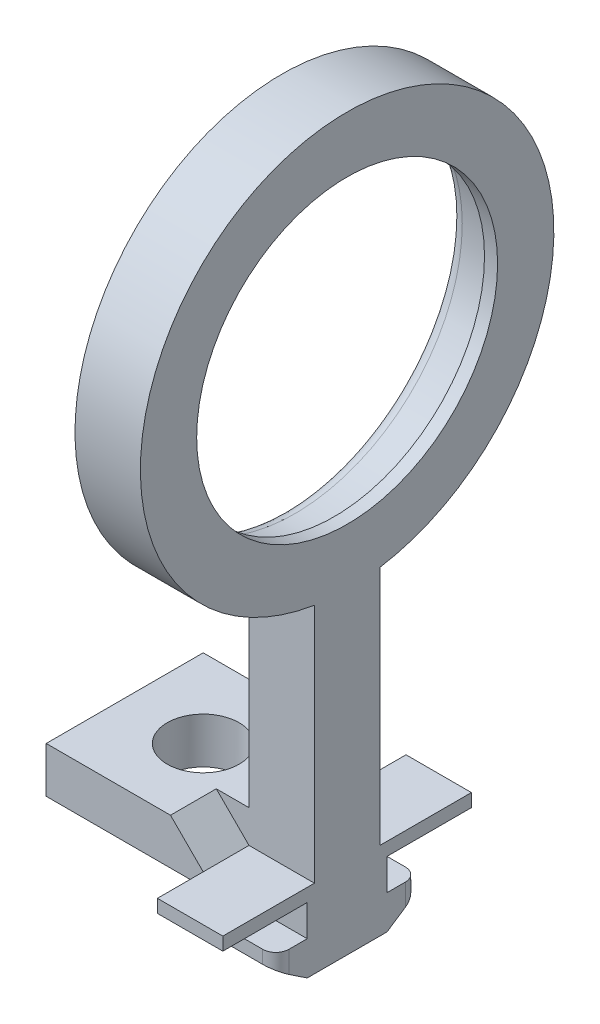
ISO-10303-21;
HEADER;
FILE_DESCRIPTION(('STEP AP214'),'2;1');
FILE_NAME('part.step','',(''),(''),'','','');
FILE_SCHEMA(('AUTOMOTIVE_DESIGN { 1 0 10303 214 1 1 1 1 }'));
ENDSEC;
DATA;
#1=APPLICATION_CONTEXT('core data for automotive mechanical design processes');
#2=APPLICATION_PROTOCOL_DEFINITION('international standard','automotive_design',2000,#1);
#3=PRODUCT_CONTEXT('',#1,'mechanical');
#4=PRODUCT('Part','Part','',(#3));
#5=PRODUCT_RELATED_PRODUCT_CATEGORY('part','',(#4));
#6=PRODUCT_DEFINITION_FORMATION('','',#4);
#7=PRODUCT_DEFINITION_CONTEXT('part definition',#1,'design');
#8=PRODUCT_DEFINITION('design','',#6,#7);
#9=PRODUCT_DEFINITION_SHAPE('','',#8);
#10=(LENGTH_UNIT() NAMED_UNIT(*) SI_UNIT(.MILLI.,.METRE.));
#11=(NAMED_UNIT(*) PLANE_ANGLE_UNIT() SI_UNIT($,.RADIAN.));
#12=(NAMED_UNIT(*) SI_UNIT($,.STERADIAN.) SOLID_ANGLE_UNIT());
#13=UNCERTAINTY_MEASURE_WITH_UNIT(LENGTH_MEASURE(1.E-05),#10,'distance_accuracy_value','');
#14=(GEOMETRIC_REPRESENTATION_CONTEXT(3) GLOBAL_UNCERTAINTY_ASSIGNED_CONTEXT((#13)) GLOBAL_UNIT_ASSIGNED_CONTEXT((#10,
#11,#12)) REPRESENTATION_CONTEXT('',''));
#15=CARTESIAN_POINT('',(0.,0.,0.));
#16=DIRECTION('',(0.,0.,1.));
#17=DIRECTION('',(1.,0.,0.));
#18=AXIS2_PLACEMENT_3D('',#15,#16,#17);
#19=CARTESIAN_POINT('',(-5.,0.,0.));
#20=DIRECTION('',(1.,0.,0.));
#21=DIRECTION('',(0.,0.,-1.));
#22=AXIS2_PLACEMENT_3D('',#19,#20,#21);
#23=CYLINDRICAL_SURFACE('',#22,12.8);
#24=CARTESIAN_POINT('',(-4.,0.,0.));
#25=DIRECTION('',(1.,0.,0.));
#26=DIRECTION('',(0.,0.,-1.));
#27=AXIS2_PLACEMENT_3D('',#24,#25,#26);
#28=CIRCLE('',#27,12.8);
#29=CARTESIAN_POINT('',(-4.,0.,-12.8));
#30=VERTEX_POINT('',#29);
#31=EDGE_CURVE('E52',#30,#30,#28,.F.);
#32=ORIENTED_EDGE('',*,*,#31,.T.);
#33=EDGE_LOOP('',(#32));
#34=FACE_BOUND('',#33,.T.);
#35=CARTESIAN_POINT('',(-1.,0.,0.));
#36=DIRECTION('',(1.,0.,0.));
#37=DIRECTION('',(0.,0.,-1.));
#38=AXIS2_PLACEMENT_3D('',#35,#36,#37);
#39=CIRCLE('',#38,12.8);
#40=CARTESIAN_POINT('',(-1.,0.,-12.8));
#41=VERTEX_POINT('',#40);
#42=EDGE_CURVE('E11',#41,#41,#39,.F.);
#43=ORIENTED_EDGE('',*,*,#42,.F.);
#44=EDGE_LOOP('',(#43));
#45=FACE_BOUND('',#44,.T.);
#46=ADVANCED_FACE('F43',(#34,#45),#23,.F.);
#47=CARTESIAN_POINT('',(-5.,0.,0.));
#48=DIRECTION('',(1.,0.,0.));
#49=DIRECTION('',(0.,0.,-1.));
#50=AXIS2_PLACEMENT_3D('',#47,#48,#49);
#51=PLANE('',#50);
#52=DIRECTION('',(0.,1.,0.));
#53=VECTOR('',#52,1.);
#54=CARTESIAN_POINT('',(-5.,-31.5,5.99999999999999));
#55=LINE('',#54,#53);
#56=CARTESIAN_POINT('',(-5.,-35.,5.99999999999999));
#57=VERTEX_POINT('',#56);
#58=CARTESIAN_POINT('',(-5.,-34.,5.99999999999999));
#59=VERTEX_POINT('',#58);
#60=EDGE_CURVE('E247',#57,#59,#55,.T.);
#61=ORIENTED_EDGE('',*,*,#60,.F.);
#62=DIRECTION('',(0.,0.,-1.));
#63=VECTOR('',#62,1.);
#64=CARTESIAN_POINT('',(-5.,-35.,3.05));
#65=LINE('',#64,#63);
#66=CARTESIAN_POINT('',(-5.,-35.,9.5));
#67=VERTEX_POINT('',#66);
#68=EDGE_CURVE('E275',#67,#57,#65,.T.);
#69=ORIENTED_EDGE('',*,*,#68,.F.);
#70=DIRECTION('',(0.,-1.,0.));
#71=VECTOR('',#70,1.);
#72=CARTESIAN_POINT('',(-5.,-35.,9.5));
#73=LINE('',#72,#71);
#74=CARTESIAN_POINT('',(-5.,-34.,9.50000000000001));
#75=VERTEX_POINT('',#74);
#76=EDGE_CURVE('E268',#75,#67,#73,.T.);
#77=ORIENTED_EDGE('',*,*,#76,.F.);
#78=DIRECTION('',(0.,0.,1.));
#79=VECTOR('',#78,1.);
#80=CARTESIAN_POINT('',(-5.,-34.,9.50000000000001));
#81=LINE('',#80,#79);
#82=EDGE_CURVE('E270',#59,#75,#81,.T.);
#83=ORIENTED_EDGE('',*,*,#82,.F.);
#84=EDGE_LOOP('',(#61,#69,#77,#83));
#85=FACE_BOUND('',#84,.T.);
#86=ADVANCED_FACE('F522',(#85),#51,.F.);
#87=DIRECTION('',(0.,0.,1.));
#88=VECTOR('',#87,1.);
#89=CARTESIAN_POINT('',(-5.,-35.,-6.00000000000001));
#90=LINE('',#89,#88);
#91=CARTESIAN_POINT('',(-5.,-35.,-3.05));
#92=VERTEX_POINT('',#91);
#93=CARTESIAN_POINT('',(-5.,-35.,3.05));
#94=VERTEX_POINT('',#93);
#95=EDGE_CURVE('E482',#92,#94,#90,.T.);
#96=ORIENTED_EDGE('',*,*,#95,.F.);
#97=DIRECTION('',(0.,1.,0.));
#98=VECTOR('',#97,1.);
#99=CARTESIAN_POINT('',(-5.,-35.,-3.05));
#100=LINE('',#99,#98);
#101=CARTESIAN_POINT('',(-5.,-37.4,-3.05));
#102=VERTEX_POINT('',#101);
#103=EDGE_CURVE('E311',#102,#92,#100,.T.);
#104=ORIENTED_EDGE('',*,*,#103,.F.);
#105=DIRECTION('',(0.,0.,1.));
#106=VECTOR('',#105,1.);
#107=CARTESIAN_POINT('',(-5.,-37.4,-3.05));
#108=LINE('',#107,#106);
#109=CARTESIAN_POINT('',(-5.,-37.4,-5.45));
#110=VERTEX_POINT('',#109);
#111=EDGE_CURVE('E307',#110,#102,#108,.T.);
#112=ORIENTED_EDGE('',*,*,#111,.F.);
#113=DIRECTION('',(0.,1.,0.));
#114=VECTOR('',#113,1.);
#115=CARTESIAN_POINT('',(-5.,-37.4,-5.45));
#116=LINE('',#115,#114);
#117=CARTESIAN_POINT('',(-5.,-38.4,-5.45));
#118=VERTEX_POINT('',#117);
#119=EDGE_CURVE('E303',#118,#110,#116,.T.);
#120=ORIENTED_EDGE('',*,*,#119,.F.);
#121=DIRECTION('',(0.,0.55470019622523,-0.832050294337843));
#122=VECTOR('',#121,1.);
#123=CARTESIAN_POINT('',(-5.,-38.4,-5.45));
#124=LINE('',#123,#122);
#125=CARTESIAN_POINT('',(-5.,-40.,-3.05));
#126=VERTEX_POINT('',#125);
#127=EDGE_CURVE('E299',#126,#118,#124,.T.);
#128=ORIENTED_EDGE('',*,*,#127,.F.);
#129=DIRECTION('',(0.,0.,-1.));
#130=VECTOR('',#129,1.);
#131=CARTESIAN_POINT('',(-5.,-40.,-3.05));
#132=LINE('',#131,#130);
#133=CARTESIAN_POINT('',(-5.,-40.,3.05));
#134=VERTEX_POINT('',#133);
#135=EDGE_CURVE('E295',#134,#126,#132,.T.);
#136=ORIENTED_EDGE('',*,*,#135,.F.);
#137=DIRECTION('',(0.,-0.554700196225229,-0.832050294337844));
#138=VECTOR('',#137,1.);
#139=CARTESIAN_POINT('',(-5.,-38.4,5.45));
#140=LINE('',#139,#138);
#141=CARTESIAN_POINT('',(-5.,-38.4,5.45));
#142=VERTEX_POINT('',#141);
#143=EDGE_CURVE('E291',#142,#134,#140,.T.);
#144=ORIENTED_EDGE('',*,*,#143,.F.);
#145=DIRECTION('',(0.,-1.,0.));
#146=VECTOR('',#145,1.);
#147=CARTESIAN_POINT('',(-5.,-37.4,5.45));
#148=LINE('',#147,#146);
#149=CARTESIAN_POINT('',(-5.,-37.4,5.45));
#150=VERTEX_POINT('',#149);
#151=EDGE_CURVE('E287',#150,#142,#148,.T.);
#152=ORIENTED_EDGE('',*,*,#151,.F.);
#153=DIRECTION('',(0.,0.,1.));
#154=VECTOR('',#153,1.);
#155=CARTESIAN_POINT('',(-5.,-37.4,3.05));
#156=LINE('',#155,#154);
#157=CARTESIAN_POINT('',(-5.,-37.4,3.05));
#158=VERTEX_POINT('',#157);
#159=EDGE_CURVE('E283',#158,#150,#156,.T.);
#160=ORIENTED_EDGE('',*,*,#159,.F.);
#161=DIRECTION('',(0.,-1.,0.));
#162=VECTOR('',#161,1.);
#163=CARTESIAN_POINT('',(-5.,-35.,3.05));
#164=LINE('',#163,#162);
#165=EDGE_CURVE('E279',#94,#158,#164,.T.);
#166=ORIENTED_EDGE('',*,*,#165,.F.);
#167=EDGE_LOOP('',(#96,#104,#112,#120,#128,#136,#144,#152,#160,#166));
#168=FACE_BOUND('',#167,.T.);
#169=ADVANCED_FACE('F558',(#168),#51,.F.);
#170=DIRECTION('',(0.,-1.,0.));
#171=VECTOR('',#170,1.);
#172=CARTESIAN_POINT('',(-5.,-31.5,-6.00000000000001));
#173=LINE('',#172,#171);
#174=CARTESIAN_POINT('',(-5.,-34.,-6.00000000000001));
#175=VERTEX_POINT('',#174);
#176=CARTESIAN_POINT('',(-5.,-35.,-6.00000000000001));
#177=VERTEX_POINT('',#176);
#178=EDGE_CURVE('E528',#175,#177,#173,.T.);
#179=ORIENTED_EDGE('',*,*,#178,.F.);
#180=CARTESIAN_POINT('',(-5.,-34.,-9.5));
#181=VERTEX_POINT('',#180);
#182=EDGE_CURVE('E264',#181,#175,#81,.T.);
#183=ORIENTED_EDGE('',*,*,#182,.F.);
#184=DIRECTION('',(0.,1.,0.));
#185=VECTOR('',#184,1.);
#186=CARTESIAN_POINT('',(-5.,-34.,-9.5));
#187=LINE('',#186,#185);
#188=CARTESIAN_POINT('',(-5.,-35.,-9.5));
#189=VERTEX_POINT('',#188);
#190=EDGE_CURVE('E318',#189,#181,#187,.T.);
#191=ORIENTED_EDGE('',*,*,#190,.F.);
#192=DIRECTION('',(0.,0.,-1.));
#193=VECTOR('',#192,1.);
#194=CARTESIAN_POINT('',(-5.,-35.,-3.05));
#195=LINE('',#194,#193);
#196=EDGE_CURVE('E315',#177,#189,#195,.T.);
#197=ORIENTED_EDGE('',*,*,#196,.F.);
#198=EDGE_LOOP('',(#179,#183,#191,#197));
#199=FACE_BOUND('',#198,.T.);
#200=ADVANCED_FACE('F520',(#199),#51,.F.);
#201=CARTESIAN_POINT('',(-5.,0.,0.));
#202=DIRECTION('',(1.,0.,0.));
#203=DIRECTION('',(0.,0.,-1.));
#204=AXIS2_PLACEMENT_3D('',#201,#202,#203);
#205=CIRCLE('',#204,13.8);
#206=CARTESIAN_POINT('',(-5.,0.,-13.8));
#207=VERTEX_POINT('',#206);
#208=EDGE_CURVE('E501',#207,#207,#205,.T.);
#209=ORIENTED_EDGE('',*,*,#208,.T.);
#210=EDGE_LOOP('',(#209));
#211=FACE_BOUND('',#210,.T.);
#212=DIRECTION('',(0.,0.,-1.));
#213=VECTOR('',#212,1.);
#214=CARTESIAN_POINT('',(-5.,-31.5,-6.00000000000001));
#215=LINE('',#214,#213);
#216=CARTESIAN_POINT('',(-5.,-31.5,2.5));
#217=VERTEX_POINT('',#216);
#218=CARTESIAN_POINT('',(-5.,-31.5,-2.5));
#219=VERTEX_POINT('',#218);
#220=EDGE_CURVE('E478',#217,#219,#215,.T.);
#221=ORIENTED_EDGE('',*,*,#220,.F.);
#222=DIRECTION('',(0.,-1.,0.));
#223=VECTOR('',#222,1.);
#224=CARTESIAN_POINT('',(-5.,-35.,2.5));
#225=LINE('',#224,#223);
#226=CARTESIAN_POINT('',(-5.,-15.6009615088301,2.5));
#227=VERTEX_POINT('',#226);
#228=EDGE_CURVE('E422',#227,#217,#225,.T.);
#229=ORIENTED_EDGE('',*,*,#228,.F.);
#230=CARTESIAN_POINT('',(-5.,0.,0.));
#231=DIRECTION('',(1.,0.,0.));
#232=DIRECTION('',(0.,0.,-1.));
#233=AXIS2_PLACEMENT_3D('',#230,#231,#232);
#234=CIRCLE('',#233,15.8);
#235=CARTESIAN_POINT('',(-5.,-15.6009615088301,-2.5));
#236=VERTEX_POINT('',#235);
#237=EDGE_CURVE('E441',#236,#227,#234,.T.);
#238=ORIENTED_EDGE('',*,*,#237,.F.);
#239=DIRECTION('',(0.,1.,0.));
#240=VECTOR('',#239,1.);
#241=CARTESIAN_POINT('',(-5.,-35.,-2.5));
#242=LINE('',#241,#240);
#243=EDGE_CURVE('E419',#219,#236,#242,.T.);
#244=ORIENTED_EDGE('',*,*,#243,.F.);
#245=EDGE_LOOP('',(#221,#229,#238,#244));
#246=FACE_BOUND('',#245,.T.);
#247=ADVANCED_FACE('F516',(#211,#246),#51,.F.);
#248=CARTESIAN_POINT('',(-5.,0.,0.));
#249=DIRECTION('',(1.,0.,0.));
#250=DIRECTION('',(0.,0.,-1.));
#251=AXIS2_PLACEMENT_3D('',#248,#249,#250);
#252=CYLINDRICAL_SURFACE('',#251,15.8);
#253=DIRECTION('',(1.,0.,0.));
#254=VECTOR('',#253,1.);
#255=CARTESIAN_POINT('',(-5.,-15.6009615088301,2.5));
#256=LINE('',#255,#254);
#257=CARTESIAN_POINT('',(0.,-15.6009615088301,2.5));
#258=VERTEX_POINT('',#257);
#259=EDGE_CURVE('E433',#227,#258,#256,.T.);
#260=ORIENTED_EDGE('',*,*,#259,.T.);
#261=CARTESIAN_POINT('',(0.,0.,0.));
#262=DIRECTION('',(1.,0.,0.));
#263=DIRECTION('',(0.,0.,-1.));
#264=AXIS2_PLACEMENT_3D('',#261,#262,#263);
#265=CIRCLE('',#264,15.8);
#266=CARTESIAN_POINT('',(0.,-15.6009615088301,-2.5));
#267=VERTEX_POINT('',#266);
#268=EDGE_CURVE('E437',#267,#258,#265,.T.);
#269=ORIENTED_EDGE('',*,*,#268,.F.);
#270=DIRECTION('',(1.,0.,0.));
#271=VECTOR('',#270,1.);
#272=CARTESIAN_POINT('',(-5.,-15.6009615088301,-2.5));
#273=LINE('',#272,#271);
#274=EDGE_CURVE('E427',#236,#267,#273,.T.);
#275=ORIENTED_EDGE('',*,*,#274,.F.);
#276=ORIENTED_EDGE('',*,*,#237,.T.);
#277=EDGE_LOOP('',(#260,#269,#275,#276));
#278=FACE_BOUND('',#277,.T.);
#279=ADVANCED_FACE('F519',(#278),#252,.T.);
#280=CARTESIAN_POINT('',(0.,0.,0.));
#281=DIRECTION('',(1.,0.,0.));
#282=DIRECTION('',(0.,0.,-1.));
#283=AXIS2_PLACEMENT_3D('',#280,#281,#282);
#284=PLANE('',#283);
#285=DIRECTION('',(0.,0.,1.));
#286=VECTOR('',#285,1.);
#287=CARTESIAN_POINT('',(0.,-37.4,3.05));
#288=LINE('',#287,#286);
#289=CARTESIAN_POINT('',(0.,-37.4,3.05));
#290=VERTEX_POINT('',#289);
#291=CARTESIAN_POINT('',(0.,-37.4,4.45));
#292=VERTEX_POINT('',#291);
#293=EDGE_CURVE('E337',#290,#292,#288,.T.);
#294=ORIENTED_EDGE('',*,*,#293,.T.);
#295=DIRECTION('',(0.,-1.,0.));
#296=VECTOR('',#295,1.);
#297=CARTESIAN_POINT('',(0.,0.,4.45000000000013));
#298=LINE('',#297,#296);
#299=CARTESIAN_POINT('',(0.,-39.0666666666667,4.44999999999999));
#300=VERTEX_POINT('',#299);
#301=EDGE_CURVE('E456',#292,#300,#298,.T.);
#302=ORIENTED_EDGE('',*,*,#301,.T.);
#303=DIRECTION('',(0.,-0.554700196225229,-0.832050294337844));
#304=VECTOR('',#303,1.);
#305=CARTESIAN_POINT('',(0.,-38.4,5.45));
#306=LINE('',#305,#304);
#307=CARTESIAN_POINT('',(0.,-40.,3.05));
#308=VERTEX_POINT('',#307);
#309=EDGE_CURVE('E341',#300,#308,#306,.T.);
#310=ORIENTED_EDGE('',*,*,#309,.T.);
#311=DIRECTION('',(0.,0.,-1.));
#312=VECTOR('',#311,1.);
#313=CARTESIAN_POINT('',(0.,-40.,-3.05));
#314=LINE('',#313,#312);
#315=CARTESIAN_POINT('',(0.,-40.,-3.05));
#316=VERTEX_POINT('',#315);
#317=EDGE_CURVE('E344',#308,#316,#314,.T.);
#318=ORIENTED_EDGE('',*,*,#317,.T.);
#319=DIRECTION('',(0.,0.55470019622523,-0.832050294337843));
#320=VECTOR('',#319,1.);
#321=CARTESIAN_POINT('',(0.,-38.4,-5.45));
#322=LINE('',#321,#320);
#323=CARTESIAN_POINT('',(0.,-39.0666666666667,-4.45));
#324=VERTEX_POINT('',#323);
#325=EDGE_CURVE('E348',#316,#324,#322,.T.);
#326=ORIENTED_EDGE('',*,*,#325,.T.);
#327=DIRECTION('',(0.,1.,0.));
#328=VECTOR('',#327,1.);
#329=CARTESIAN_POINT('',(0.,0.,-4.45000000000003));
#330=LINE('',#329,#328);
#331=CARTESIAN_POINT('',(0.,-37.4,-4.45));
#332=VERTEX_POINT('',#331);
#333=EDGE_CURVE('E452',#324,#332,#330,.T.);
#334=ORIENTED_EDGE('',*,*,#333,.T.);
#335=DIRECTION('',(0.,0.,1.));
#336=VECTOR('',#335,1.);
#337=CARTESIAN_POINT('',(0.,-37.4,-3.05));
#338=LINE('',#337,#336);
#339=CARTESIAN_POINT('',(0.,-37.4,-3.05));
#340=VERTEX_POINT('',#339);
#341=EDGE_CURVE('E352',#332,#340,#338,.T.);
#342=ORIENTED_EDGE('',*,*,#341,.T.);
#343=DIRECTION('',(0.,1.,0.));
#344=VECTOR('',#343,1.);
#345=CARTESIAN_POINT('',(0.,-35.,-3.05));
#346=LINE('',#345,#344);
#347=CARTESIAN_POINT('',(0.,-35.,-3.05));
#348=VERTEX_POINT('',#347);
#349=EDGE_CURVE('E355',#340,#348,#346,.T.);
#350=ORIENTED_EDGE('',*,*,#349,.T.);
#351=DIRECTION('',(0.,0.,-1.));
#352=VECTOR('',#351,1.);
#353=CARTESIAN_POINT('',(0.,-35.,-3.05));
#354=LINE('',#353,#352);
#355=CARTESIAN_POINT('',(0.,-35.,-9.5));
#356=VERTEX_POINT('',#355);
#357=EDGE_CURVE('E359',#348,#356,#354,.T.);
#358=ORIENTED_EDGE('',*,*,#357,.T.);
#359=DIRECTION('',(0.,1.,0.));
#360=VECTOR('',#359,1.);
#361=CARTESIAN_POINT('',(0.,-34.,-9.5));
#362=LINE('',#361,#360);
#363=CARTESIAN_POINT('',(0.,-34.,-9.5));
#364=VERTEX_POINT('',#363);
#365=EDGE_CURVE('E363',#356,#364,#362,.T.);
#366=ORIENTED_EDGE('',*,*,#365,.T.);
#367=DIRECTION('',(0.,0.,1.));
#368=VECTOR('',#367,1.);
#369=CARTESIAN_POINT('',(0.,-34.,9.50000000000001));
#370=LINE('',#369,#368);
#371=CARTESIAN_POINT('',(0.,-34.,-2.5));
#372=VERTEX_POINT('',#371);
#373=EDGE_CURVE('E258',#364,#372,#370,.T.);
#374=ORIENTED_EDGE('',*,*,#373,.T.);
#375=DIRECTION('',(0.,1.,0.));
#376=VECTOR('',#375,1.);
#377=CARTESIAN_POINT('',(0.,-35.,-2.5));
#378=LINE('',#377,#376);
#379=EDGE_CURVE('E418',#372,#267,#378,.T.);
#380=ORIENTED_EDGE('',*,*,#379,.T.);
#381=ORIENTED_EDGE('',*,*,#268,.T.);
#382=DIRECTION('',(0.,-1.,0.));
#383=VECTOR('',#382,1.);
#384=CARTESIAN_POINT('',(0.,-35.,2.5));
#385=LINE('',#384,#383);
#386=CARTESIAN_POINT('',(0.,-34.,2.5));
#387=VERTEX_POINT('',#386);
#388=EDGE_CURVE('E423',#258,#387,#385,.T.);
#389=ORIENTED_EDGE('',*,*,#388,.T.);
#390=CARTESIAN_POINT('',(0.,-34.,9.50000000000001));
#391=VERTEX_POINT('',#390);
#392=EDGE_CURVE('E254',#387,#391,#370,.T.);
#393=ORIENTED_EDGE('',*,*,#392,.T.);
#394=DIRECTION('',(0.,-1.,0.));
#395=VECTOR('',#394,1.);
#396=CARTESIAN_POINT('',(0.,-35.,9.5));
#397=LINE('',#396,#395);
#398=CARTESIAN_POINT('',(0.,-35.,9.5));
#399=VERTEX_POINT('',#398);
#400=EDGE_CURVE('E325',#391,#399,#397,.T.);
#401=ORIENTED_EDGE('',*,*,#400,.T.);
#402=DIRECTION('',(0.,0.,-1.));
#403=VECTOR('',#402,1.);
#404=CARTESIAN_POINT('',(0.,-35.,3.05));
#405=LINE('',#404,#403);
#406=CARTESIAN_POINT('',(0.,-35.,3.05));
#407=VERTEX_POINT('',#406);
#408=EDGE_CURVE('E329',#399,#407,#405,.T.);
#409=ORIENTED_EDGE('',*,*,#408,.T.);
#410=DIRECTION('',(0.,-1.,0.));
#411=VECTOR('',#410,1.);
#412=CARTESIAN_POINT('',(0.,-35.,3.05));
#413=LINE('',#412,#411);
#414=EDGE_CURVE('E333',#407,#290,#413,.T.);
#415=ORIENTED_EDGE('',*,*,#414,.T.);
#416=EDGE_LOOP('',(#294,#302,#310,#318,#326,#334,#342,#350,#358,#366,#374,#380,#381,#389,#393,
#401,#409,#415));
#417=FACE_BOUND('',#416,.T.);
#418=CARTESIAN_POINT('',(0.,0.,0.));
#419=DIRECTION('',(1.,0.,0.));
#420=DIRECTION('',(0.,0.,-1.));
#421=AXIS2_PLACEMENT_3D('',#418,#419,#420);
#422=CIRCLE('',#421,11.5);
#423=CARTESIAN_POINT('',(0.,0.,-11.5));
#424=VERTEX_POINT('',#423);
#425=EDGE_CURVE('E738',#424,#424,#422,.T.);
#426=ORIENTED_EDGE('',*,*,#425,.F.);
#427=EDGE_LOOP('',(#426));
#428=FACE_BOUND('',#427,.T.);
#429=ADVANCED_FACE('F537',(#417,#428),#284,.T.);
#430=CARTESIAN_POINT('',(-5.,-35.,-2.5));
#431=DIRECTION('',(0.,0.,-1.));
#432=DIRECTION('',(0.,1.,0.));
#433=AXIS2_PLACEMENT_3D('',#430,#431,#432);
#434=PLANE('',#433);
#435=DIRECTION('',(1.,0.,0.));
#436=VECTOR('',#435,1.);
#437=CARTESIAN_POINT('',(-5.,-34.,-2.5));
#438=LINE('',#437,#436);
#439=CARTESIAN_POINT('',(-5.,-34.,-2.5));
#440=VERTEX_POINT('',#439);
#441=EDGE_CURVE('E370',#440,#372,#438,.T.);
#442=ORIENTED_EDGE('',*,*,#441,.F.);
#443=DIRECTION('',(0.707106781186547,-0.707106781186548,0.));
#444=VECTOR('',#443,1.);
#445=CARTESIAN_POINT('',(-7.50000000000001,-31.5,-2.5));
#446=LINE('',#445,#444);
#447=CARTESIAN_POINT('',(-7.50000000000001,-31.5,-2.5));
#448=VERTEX_POINT('',#447);
#449=EDGE_CURVE('E498',#440,#448,#446,.F.);
#450=ORIENTED_EDGE('',*,*,#449,.T.);
#451=DIRECTION('',(-1.,0.,0.));
#452=VECTOR('',#451,1.);
#453=CARTESIAN_POINT('',(-5.,-31.5,-2.5));
#454=LINE('',#453,#452);
#455=EDGE_CURVE('E59',#219,#448,#454,.T.);
#456=ORIENTED_EDGE('',*,*,#455,.F.);
#457=ORIENTED_EDGE('',*,*,#243,.T.);
#458=ORIENTED_EDGE('',*,*,#274,.T.);
#459=ORIENTED_EDGE('',*,*,#379,.F.);
#460=EDGE_LOOP('',(#442,#450,#456,#457,#458,#459));
#461=FACE_BOUND('',#460,.T.);
#462=ADVANCED_FACE('F542',(#461),#434,.T.);
#463=CARTESIAN_POINT('',(-5.,-35.,2.5));
#464=DIRECTION('',(0.,0.,1.));
#465=DIRECTION('',(0.,-1.,0.));
#466=AXIS2_PLACEMENT_3D('',#463,#464,#465);
#467=PLANE('',#466);
#468=DIRECTION('',(-1.,0.,0.));
#469=VECTOR('',#468,1.);
#470=CARTESIAN_POINT('',(-5.,-34.,2.5));
#471=LINE('',#470,#469);
#472=CARTESIAN_POINT('',(-5.,-34.,2.5));
#473=VERTEX_POINT('',#472);
#474=EDGE_CURVE('E445',#387,#473,#471,.T.);
#475=ORIENTED_EDGE('',*,*,#474,.F.);
#476=ORIENTED_EDGE('',*,*,#388,.F.);
#477=ORIENTED_EDGE('',*,*,#259,.F.);
#478=ORIENTED_EDGE('',*,*,#228,.T.);
#479=DIRECTION('',(1.,0.,0.));
#480=VECTOR('',#479,1.);
#481=CARTESIAN_POINT('',(-5.,-31.5,2.5));
#482=LINE('',#481,#480);
#483=CARTESIAN_POINT('',(-7.50000000000001,-31.5,2.5));
#484=VERTEX_POINT('',#483);
#485=EDGE_CURVE('E485',#484,#217,#482,.T.);
#486=ORIENTED_EDGE('',*,*,#485,.F.);
#487=DIRECTION('',(-0.707106781186547,0.707106781186548,0.));
#488=VECTOR('',#487,1.);
#489=CARTESIAN_POINT('',(-7.50000000000001,-31.5,2.5));
#490=LINE('',#489,#488);
#491=EDGE_CURVE('E67',#484,#473,#490,.F.);
#492=ORIENTED_EDGE('',*,*,#491,.T.);
#493=EDGE_LOOP('',(#475,#476,#477,#478,#486,#492));
#494=FACE_BOUND('',#493,.T.);
#495=ADVANCED_FACE('F532',(#494),#467,.T.);
#496=CARTESIAN_POINT('',(-5.,-34.,9.50000000000001));
#497=DIRECTION('',(0.,1.,0.));
#498=DIRECTION('',(0.,0.,1.));
#499=AXIS2_PLACEMENT_3D('',#496,#497,#498);
#500=PLANE('',#499);
#501=ORIENTED_EDGE('',*,*,#182,.T.);
#502=EDGE_CURVE('E269',#175,#440,#81,.T.);
#503=ORIENTED_EDGE('',*,*,#502,.T.);
#504=ORIENTED_EDGE('',*,*,#441,.T.);
#505=ORIENTED_EDGE('',*,*,#373,.F.);
#506=DIRECTION('',(1.,0.,0.));
#507=VECTOR('',#506,1.);
#508=CARTESIAN_POINT('',(-5.,-34.,-9.5));
#509=LINE('',#508,#507);
#510=EDGE_CURVE('E367',#181,#364,#509,.T.);
#511=ORIENTED_EDGE('',*,*,#510,.F.);
#512=EDGE_LOOP('',(#501,#503,#504,#505,#511));
#513=FACE_BOUND('',#512,.T.);
#514=ADVANCED_FACE('F550',(#513),#500,.T.);
#515=ORIENTED_EDGE('',*,*,#392,.F.);
#516=ORIENTED_EDGE('',*,*,#474,.T.);
#517=EDGE_CURVE('E271',#473,#59,#81,.T.);
#518=ORIENTED_EDGE('',*,*,#517,.T.);
#519=ORIENTED_EDGE('',*,*,#82,.T.);
#520=DIRECTION('',(1.,0.,0.));
#521=VECTOR('',#520,1.);
#522=CARTESIAN_POINT('',(-5.,-34.,9.50000000000001));
#523=LINE('',#522,#521);
#524=EDGE_CURVE('E321',#75,#391,#523,.T.);
#525=ORIENTED_EDGE('',*,*,#524,.T.);
#526=EDGE_LOOP('',(#515,#516,#518,#519,#525));
#527=FACE_BOUND('',#526,.T.);
#528=ADVANCED_FACE('F620',(#527),#500,.T.);
#529=CARTESIAN_POINT('',(-5.,-34.,-9.5));
#530=DIRECTION('',(0.,0.,-1.));
#531=DIRECTION('',(-1.,0.,0.));
#532=AXIS2_PLACEMENT_3D('',#529,#530,#531);
#533=PLANE('',#532);
#534=ORIENTED_EDGE('',*,*,#365,.F.);
#535=DIRECTION('',(1.,0.,0.));
#536=VECTOR('',#535,1.);
#537=CARTESIAN_POINT('',(-5.,-35.,-9.5));
#538=LINE('',#537,#536);
#539=EDGE_CURVE('E371',#189,#356,#538,.T.);
#540=ORIENTED_EDGE('',*,*,#539,.F.);
#541=ORIENTED_EDGE('',*,*,#190,.T.);
#542=ORIENTED_EDGE('',*,*,#510,.T.);
#543=EDGE_LOOP('',(#534,#540,#541,#542));
#544=FACE_BOUND('',#543,.T.);
#545=ADVANCED_FACE('F685',(#544),#533,.T.);
#546=CARTESIAN_POINT('',(-5.,-35.,-3.05));
#547=DIRECTION('',(0.,-1.,0.));
#548=DIRECTION('',(0.,0.,-1.));
#549=AXIS2_PLACEMENT_3D('',#546,#547,#548);
#550=PLANE('',#549);
#551=CARTESIAN_POINT('',(-11.,-35.,0.));
#552=DIRECTION('',(0.,-1.,0.));
#553=DIRECTION('',(0.,0.,-1.));
#554=AXIS2_PLACEMENT_3D('',#551,#552,#553);
#555=CIRCLE('',#554,2.75);
#556=CARTESIAN_POINT('',(-11.,-35.,-2.75000000000001));
#557=VERTEX_POINT('',#556);
#558=EDGE_CURVE('E737',#557,#557,#555,.F.);
#559=ORIENTED_EDGE('',*,*,#558,.T.);
#560=EDGE_LOOP('',(#559));
#561=FACE_BOUND('',#560,.T.);
#562=ORIENTED_EDGE('',*,*,#357,.F.);
#563=DIRECTION('',(1.,0.,0.));
#564=VECTOR('',#563,1.);
#565=CARTESIAN_POINT('',(-5.,-35.,-3.05));
#566=LINE('',#565,#564);
#567=EDGE_CURVE('E374',#92,#348,#566,.T.);
#568=ORIENTED_EDGE('',*,*,#567,.F.);
#569=ORIENTED_EDGE('',*,*,#95,.T.);
#570=DIRECTION('',(1.,0.,0.));
#571=VECTOR('',#570,1.);
#572=CARTESIAN_POINT('',(-5.,-35.,3.05));
#573=LINE('',#572,#571);
#574=EDGE_CURVE('E407',#94,#407,#573,.T.);
#575=ORIENTED_EDGE('',*,*,#574,.T.);
#576=ORIENTED_EDGE('',*,*,#408,.F.);
#577=DIRECTION('',(1.,0.,0.));
#578=VECTOR('',#577,1.);
#579=CARTESIAN_POINT('',(-5.,-35.,9.5));
#580=LINE('',#579,#578);
#581=EDGE_CURVE('E410',#67,#399,#580,.T.);
#582=ORIENTED_EDGE('',*,*,#581,.F.);
#583=ORIENTED_EDGE('',*,*,#68,.T.);
#584=DIRECTION('',(1.,0.,0.));
#585=VECTOR('',#584,1.);
#586=CARTESIAN_POINT('',(-17.,-35.,5.99999999999999));
#587=LINE('',#586,#585);
#588=CARTESIAN_POINT('',(-17.,-35.,5.99999999999999));
#589=VERTEX_POINT('',#588);
#590=EDGE_CURVE('E596',#589,#57,#587,.T.);
#591=ORIENTED_EDGE('',*,*,#590,.F.);
#592=DIRECTION('',(0.,0.,1.));
#593=VECTOR('',#592,1.);
#594=CARTESIAN_POINT('',(-17.,-35.,-6.00000000000001));
#595=LINE('',#594,#593);
#596=CARTESIAN_POINT('',(-17.,-35.,-6.00000000000001));
#597=VERTEX_POINT('',#596);
#598=EDGE_CURVE('E242',#597,#589,#595,.T.);
#599=ORIENTED_EDGE('',*,*,#598,.F.);
#600=DIRECTION('',(1.,0.,0.));
#601=VECTOR('',#600,1.);
#602=CARTESIAN_POINT('',(-17.,-35.,-6.00000000000001));
#603=LINE('',#602,#601);
#604=EDGE_CURVE('E260',#597,#177,#603,.T.);
#605=ORIENTED_EDGE('',*,*,#604,.T.);
#606=ORIENTED_EDGE('',*,*,#196,.T.);
#607=ORIENTED_EDGE('',*,*,#539,.T.);
#608=EDGE_LOOP('',(#562,#568,#569,#575,#576,#582,#583,#591,#599,#605,#606,#607));
#609=FACE_BOUND('',#608,.T.);
#610=ADVANCED_FACE('F611',(#561,#609),#550,.T.);
#611=CARTESIAN_POINT('',(-5.,-35.,-3.05));
#612=DIRECTION('',(0.,0.,-1.));
#613=DIRECTION('',(0.,1.,0.));
#614=AXIS2_PLACEMENT_3D('',#611,#612,#613);
#615=PLANE('',#614);
#616=ORIENTED_EDGE('',*,*,#349,.F.);
#617=DIRECTION('',(1.,0.,0.));
#618=VECTOR('',#617,1.);
#619=CARTESIAN_POINT('',(-5.,-37.4,-3.05));
#620=LINE('',#619,#618);
#621=EDGE_CURVE('E377',#102,#340,#620,.T.);
#622=ORIENTED_EDGE('',*,*,#621,.F.);
#623=ORIENTED_EDGE('',*,*,#103,.T.);
#624=ORIENTED_EDGE('',*,*,#567,.T.);
#625=EDGE_LOOP('',(#616,#622,#623,#624));
#626=FACE_BOUND('',#625,.T.);
#627=ADVANCED_FACE('F701',(#626),#615,.T.);
#628=CARTESIAN_POINT('',(-5.,-37.4,-3.05));
#629=DIRECTION('',(0.,1.,0.));
#630=DIRECTION('',(0.,0.,1.));
#631=AXIS2_PLACEMENT_3D('',#628,#629,#630);
#632=PLANE('',#631);
#633=ORIENTED_EDGE('',*,*,#341,.F.);
#634=CARTESIAN_POINT('',(-1.,-37.4,-4.45));
#635=DIRECTION('',(0.,1.,0.));
#636=DIRECTION('',(0.,0.,1.));
#637=AXIS2_PLACEMENT_3D('',#634,#635,#636);
#638=CIRCLE('',#637,1.);
#639=CARTESIAN_POINT('',(-1.,-37.4,-5.45));
#640=VERTEX_POINT('',#639);
#641=EDGE_CURVE('E469',#332,#640,#638,.T.);
#642=ORIENTED_EDGE('',*,*,#641,.T.);
#643=DIRECTION('',(1.,0.,0.));
#644=VECTOR('',#643,1.);
#645=CARTESIAN_POINT('',(-5.,-37.4,-5.45));
#646=LINE('',#645,#644);
#647=EDGE_CURVE('E381',#110,#640,#646,.T.);
#648=ORIENTED_EDGE('',*,*,#647,.F.);
#649=ORIENTED_EDGE('',*,*,#111,.T.);
#650=ORIENTED_EDGE('',*,*,#621,.T.);
#651=EDGE_LOOP('',(#633,#642,#648,#649,#650));
#652=FACE_BOUND('',#651,.T.);
#653=ADVANCED_FACE('F657',(#652),#632,.T.);
#654=CARTESIAN_POINT('',(-5.,-37.4,-5.45));
#655=DIRECTION('',(0.,0.,-1.));
#656=DIRECTION('',(0.,1.,0.));
#657=AXIS2_PLACEMENT_3D('',#654,#655,#656);
#658=PLANE('',#657);
#659=ORIENTED_EDGE('',*,*,#647,.T.);
#660=DIRECTION('',(0.,1.,0.));
#661=VECTOR('',#660,1.);
#662=CARTESIAN_POINT('',(-1.,-37.4,-5.45));
#663=LINE('',#662,#661);
#664=CARTESIAN_POINT('',(-1.,-38.4,-5.45));
#665=VERTEX_POINT('',#664);
#666=EDGE_CURVE('E472',#640,#665,#663,.F.);
#667=ORIENTED_EDGE('',*,*,#666,.T.);
#668=DIRECTION('',(1.,0.,0.));
#669=VECTOR('',#668,1.);
#670=CARTESIAN_POINT('',(-5.,-38.4,-5.45));
#671=LINE('',#670,#669);
#672=EDGE_CURVE('E385',#118,#665,#671,.T.);
#673=ORIENTED_EDGE('',*,*,#672,.F.);
#674=ORIENTED_EDGE('',*,*,#119,.T.);
#675=EDGE_LOOP('',(#659,#667,#673,#674));
#676=FACE_BOUND('',#675,.T.);
#677=ADVANCED_FACE('F660',(#676),#658,.T.);
#678=CARTESIAN_POINT('',(-5.,-38.4,-5.45));
#679=DIRECTION('',(0.,-0.832050294337843,-0.55470019622523));
#680=DIRECTION('',(0.,0.55470019622523,-0.832050294337843));
#681=AXIS2_PLACEMENT_3D('',#678,#679,#680);
#682=PLANE('',#681);
#683=ORIENTED_EDGE('',*,*,#672,.T.);
#684=CARTESIAN_POINT('',(-1.,-39.0666666666667,-4.45));
#685=DIRECTION('',(0.,-0.832050294337843,-0.55470019622523));
#686=DIRECTION('',(0.,0.55470019622523,-0.832050294337843));
#687=AXIS2_PLACEMENT_3D('',#684,#685,#686);
#688=ELLIPSE('',#687,1.20185042515466,1.);
#689=EDGE_CURVE('E475',#665,#324,#688,.T.);
#690=ORIENTED_EDGE('',*,*,#689,.T.);
#691=ORIENTED_EDGE('',*,*,#325,.F.);
#692=DIRECTION('',(1.,0.,0.));
#693=VECTOR('',#692,1.);
#694=CARTESIAN_POINT('',(-5.,-40.,-3.05));
#695=LINE('',#694,#693);
#696=EDGE_CURVE('E389',#126,#316,#695,.T.);
#697=ORIENTED_EDGE('',*,*,#696,.F.);
#698=ORIENTED_EDGE('',*,*,#127,.T.);
#699=EDGE_LOOP('',(#683,#690,#691,#697,#698));
#700=FACE_BOUND('',#699,.T.);
#701=ADVANCED_FACE('F663',(#700),#682,.T.);
#702=CARTESIAN_POINT('',(-5.,-40.,-3.05));
#703=DIRECTION('',(0.,-1.,0.));
#704=DIRECTION('',(0.,0.,-1.));
#705=AXIS2_PLACEMENT_3D('',#702,#703,#704);
#706=PLANE('',#705);
#707=ORIENTED_EDGE('',*,*,#317,.F.);
#708=DIRECTION('',(1.,0.,0.));
#709=VECTOR('',#708,1.);
#710=CARTESIAN_POINT('',(-5.,-40.,3.05));
#711=LINE('',#710,#709);
#712=EDGE_CURVE('E392',#134,#308,#711,.T.);
#713=ORIENTED_EDGE('',*,*,#712,.F.);
#714=ORIENTED_EDGE('',*,*,#135,.T.);
#715=ORIENTED_EDGE('',*,*,#696,.T.);
#716=EDGE_LOOP('',(#707,#713,#714,#715));
#717=FACE_BOUND('',#716,.T.);
#718=ADVANCED_FACE('F649',(#717),#706,.T.);
#719=CARTESIAN_POINT('',(-5.,-38.4,5.45));
#720=DIRECTION('',(0.,-0.832050294337844,0.554700196225229));
#721=DIRECTION('',(0.,-0.554700196225229,-0.832050294337844));
#722=AXIS2_PLACEMENT_3D('',#719,#720,#721);
#723=PLANE('',#722);
#724=ORIENTED_EDGE('',*,*,#309,.F.);
#725=CARTESIAN_POINT('',(-1.,-39.0666666666667,4.44999999999999));
#726=DIRECTION('',(0.,-0.832050294337844,0.554700196225229));
#727=DIRECTION('',(0.,-0.554700196225229,-0.832050294337844));
#728=AXIS2_PLACEMENT_3D('',#725,#726,#727);
#729=ELLIPSE('',#728,1.20185042515467,1.);
#730=CARTESIAN_POINT('',(-1.,-38.4,5.45));
#731=VERTEX_POINT('',#730);
#732=EDGE_CURVE('E460',#300,#731,#729,.T.);
#733=ORIENTED_EDGE('',*,*,#732,.T.);
#734=DIRECTION('',(1.,0.,0.));
#735=VECTOR('',#734,1.);
#736=CARTESIAN_POINT('',(-5.,-38.4,5.45));
#737=LINE('',#736,#735);
#738=EDGE_CURVE('E396',#142,#731,#737,.T.);
#739=ORIENTED_EDGE('',*,*,#738,.F.);
#740=ORIENTED_EDGE('',*,*,#143,.T.);
#741=ORIENTED_EDGE('',*,*,#712,.T.);
#742=EDGE_LOOP('',(#724,#733,#739,#740,#741));
#743=FACE_BOUND('',#742,.T.);
#744=ADVANCED_FACE('F639',(#743),#723,.T.);
#745=CARTESIAN_POINT('',(-5.,-37.4,5.45));
#746=DIRECTION('',(0.,0.,1.));
#747=DIRECTION('',(0.,-1.,0.));
#748=AXIS2_PLACEMENT_3D('',#745,#746,#747);
#749=PLANE('',#748);
#750=ORIENTED_EDGE('',*,*,#738,.T.);
#751=DIRECTION('',(0.,-1.,0.));
#752=VECTOR('',#751,1.);
#753=CARTESIAN_POINT('',(-1.,-37.4,5.45));
#754=LINE('',#753,#752);
#755=CARTESIAN_POINT('',(-1.,-37.4,5.45));
#756=VERTEX_POINT('',#755);
#757=EDGE_CURVE('E463',#731,#756,#754,.F.);
#758=ORIENTED_EDGE('',*,*,#757,.T.);
#759=DIRECTION('',(1.,0.,0.));
#760=VECTOR('',#759,1.);
#761=CARTESIAN_POINT('',(-5.,-37.4,5.45));
#762=LINE('',#761,#760);
#763=EDGE_CURVE('E400',#150,#756,#762,.T.);
#764=ORIENTED_EDGE('',*,*,#763,.F.);
#765=ORIENTED_EDGE('',*,*,#151,.T.);
#766=EDGE_LOOP('',(#750,#758,#764,#765));
#767=FACE_BOUND('',#766,.T.);
#768=ADVANCED_FACE('F642',(#767),#749,.T.);
#769=CARTESIAN_POINT('',(-5.,-37.4,3.05));
#770=DIRECTION('',(0.,1.,0.));
#771=DIRECTION('',(0.,0.,1.));
#772=AXIS2_PLACEMENT_3D('',#769,#770,#771);
#773=PLANE('',#772);
#774=ORIENTED_EDGE('',*,*,#763,.T.);
#775=CARTESIAN_POINT('',(-1.,-37.4,4.45));
#776=DIRECTION('',(0.,1.,0.));
#777=DIRECTION('',(0.,0.,1.));
#778=AXIS2_PLACEMENT_3D('',#775,#776,#777);
#779=CIRCLE('',#778,1.);
#780=EDGE_CURVE('E466',#756,#292,#779,.T.);
#781=ORIENTED_EDGE('',*,*,#780,.T.);
#782=ORIENTED_EDGE('',*,*,#293,.F.);
#783=DIRECTION('',(1.,0.,0.));
#784=VECTOR('',#783,1.);
#785=CARTESIAN_POINT('',(-5.,-37.4,3.05));
#786=LINE('',#785,#784);
#787=EDGE_CURVE('E404',#158,#290,#786,.T.);
#788=ORIENTED_EDGE('',*,*,#787,.F.);
#789=ORIENTED_EDGE('',*,*,#159,.T.);
#790=EDGE_LOOP('',(#774,#781,#782,#788,#789));
#791=FACE_BOUND('',#790,.T.);
#792=ADVANCED_FACE('F633',(#791),#773,.T.);
#793=CARTESIAN_POINT('',(-5.,-35.,3.05));
#794=DIRECTION('',(0.,0.,1.));
#795=DIRECTION('',(0.,-1.,0.));
#796=AXIS2_PLACEMENT_3D('',#793,#794,#795);
#797=PLANE('',#796);
#798=ORIENTED_EDGE('',*,*,#414,.F.);
#799=ORIENTED_EDGE('',*,*,#574,.F.);
#800=ORIENTED_EDGE('',*,*,#165,.T.);
#801=ORIENTED_EDGE('',*,*,#787,.T.);
#802=EDGE_LOOP('',(#798,#799,#800,#801));
#803=FACE_BOUND('',#802,.T.);
#804=ADVANCED_FACE('F629',(#803),#797,.T.);
#805=CARTESIAN_POINT('',(-5.,-35.,9.5));
#806=DIRECTION('',(0.,0.,1.));
#807=DIRECTION('',(0.,-1.,0.));
#808=AXIS2_PLACEMENT_3D('',#805,#806,#807);
#809=PLANE('',#808);
#810=ORIENTED_EDGE('',*,*,#400,.F.);
#811=ORIENTED_EDGE('',*,*,#524,.F.);
#812=ORIENTED_EDGE('',*,*,#76,.T.);
#813=ORIENTED_EDGE('',*,*,#581,.T.);
#814=EDGE_LOOP('',(#810,#811,#812,#813));
#815=FACE_BOUND('',#814,.T.);
#816=ADVANCED_FACE('F567',(#815),#809,.T.);
#817=CARTESIAN_POINT('',(-1.,0.,4.45000000000013));
#818=DIRECTION('',(0.,-1.,0.));
#819=DIRECTION('',(0.,0.,-1.));
#820=AXIS2_PLACEMENT_3D('',#817,#818,#819);
#821=CYLINDRICAL_SURFACE('',#820,1.);
#822=ORIENTED_EDGE('',*,*,#780,.F.);
#823=ORIENTED_EDGE('',*,*,#757,.F.);
#824=ORIENTED_EDGE('',*,*,#732,.F.);
#825=ORIENTED_EDGE('',*,*,#301,.F.);
#826=EDGE_LOOP('',(#822,#823,#824,#825));
#827=FACE_BOUND('',#826,.T.);
#828=ADVANCED_FACE('F563',(#827),#821,.T.);
#829=CARTESIAN_POINT('',(-1.,0.,-4.45000000000003));
#830=DIRECTION('',(0.,1.,0.));
#831=DIRECTION('',(0.,0.,1.));
#832=AXIS2_PLACEMENT_3D('',#829,#830,#831);
#833=CYLINDRICAL_SURFACE('',#832,1.);
#834=ORIENTED_EDGE('',*,*,#689,.F.);
#835=ORIENTED_EDGE('',*,*,#666,.F.);
#836=ORIENTED_EDGE('',*,*,#641,.F.);
#837=ORIENTED_EDGE('',*,*,#333,.F.);
#838=EDGE_LOOP('',(#834,#835,#836,#837));
#839=FACE_BOUND('',#838,.T.);
#840=ADVANCED_FACE('F566',(#839),#833,.T.);
#841=CARTESIAN_POINT('',(-17.,-31.5,5.99999999999999));
#842=DIRECTION('',(0.,0.,-1.));
#843=DIRECTION('',(0.,1.,0.));
#844=AXIS2_PLACEMENT_3D('',#841,#842,#843);
#845=PLANE('',#844);
#846=ORIENTED_EDGE('',*,*,#60,.T.);
#847=DIRECTION('',(0.707106781186547,-0.707106781186548,0.));
#848=VECTOR('',#847,1.);
#849=CARTESIAN_POINT('',(-7.50000000000001,-31.5,5.99999999999999));
#850=LINE('',#849,#848);
#851=CARTESIAN_POINT('',(-7.50000000000001,-31.5,5.99999999999999));
#852=VERTEX_POINT('',#851);
#853=EDGE_CURVE('E252',#59,#852,#850,.F.);
#854=ORIENTED_EDGE('',*,*,#853,.T.);
#855=DIRECTION('',(1.,0.,0.));
#856=VECTOR('',#855,1.);
#857=CARTESIAN_POINT('',(-17.,-31.5,5.99999999999999));
#858=LINE('',#857,#856);
#859=CARTESIAN_POINT('',(-17.,-31.5,5.99999999999999));
#860=VERTEX_POINT('',#859);
#861=EDGE_CURVE('E229',#860,#852,#858,.T.);
#862=ORIENTED_EDGE('',*,*,#861,.F.);
#863=DIRECTION('',(0.,1.,0.));
#864=VECTOR('',#863,1.);
#865=CARTESIAN_POINT('',(-17.,-31.5,5.99999999999999));
#866=LINE('',#865,#864);
#867=EDGE_CURVE('E237',#589,#860,#866,.T.);
#868=ORIENTED_EDGE('',*,*,#867,.F.);
#869=ORIENTED_EDGE('',*,*,#590,.T.);
#870=EDGE_LOOP('',(#846,#854,#862,#868,#869));
#871=FACE_BOUND('',#870,.T.);
#872=ADVANCED_FACE('F250',(#871),#845,.F.);
#873=CARTESIAN_POINT('',(-17.,-31.5,-6.00000000000001));
#874=DIRECTION('',(0.,-1.,0.));
#875=DIRECTION('',(0.,0.,-1.));
#876=AXIS2_PLACEMENT_3D('',#873,#874,#875);
#877=PLANE('',#876);
#878=CARTESIAN_POINT('',(-11.,-31.5,0.));
#879=DIRECTION('',(0.,1.,0.));
#880=DIRECTION('',(0.,0.,1.));
#881=AXIS2_PLACEMENT_3D('',#878,#879,#880);
#882=CIRCLE('',#881,2.75);
#883=CARTESIAN_POINT('',(-11.,-31.5,2.74999999999999));
#884=VERTEX_POINT('',#883);
#885=EDGE_CURVE('E600',#884,#884,#882,.T.);
#886=ORIENTED_EDGE('',*,*,#885,.F.);
#887=EDGE_LOOP('',(#886));
#888=FACE_BOUND('',#887,.T.);
#889=ORIENTED_EDGE('',*,*,#861,.T.);
#890=DIRECTION('',(0.,0.,-1.));
#891=VECTOR('',#890,1.);
#892=CARTESIAN_POINT('',(-7.50000000000001,-31.5,-6.00000000000001));
#893=LINE('',#892,#891);
#894=EDGE_CURVE('E488',#852,#484,#893,.T.);
#895=ORIENTED_EDGE('',*,*,#894,.T.);
#896=ORIENTED_EDGE('',*,*,#485,.T.);
#897=ORIENTED_EDGE('',*,*,#220,.T.);
#898=ORIENTED_EDGE('',*,*,#455,.T.);
#899=DIRECTION('',(0.,0.,-1.));
#900=VECTOR('',#899,1.);
#901=CARTESIAN_POINT('',(-7.50000000000001,-31.5,-6.00000000000001));
#902=LINE('',#901,#900);
#903=CARTESIAN_POINT('',(-7.50000000000001,-31.5,-6.00000000000001));
#904=VERTEX_POINT('',#903);
#905=EDGE_CURVE('E481',#448,#904,#902,.T.);
#906=ORIENTED_EDGE('',*,*,#905,.T.);
#907=DIRECTION('',(1.,0.,0.));
#908=VECTOR('',#907,1.);
#909=CARTESIAN_POINT('',(-17.,-31.5,-6.00000000000001));
#910=LINE('',#909,#908);
#911=CARTESIAN_POINT('',(-17.,-31.5,-6.00000000000001));
#912=VERTEX_POINT('',#911);
#913=EDGE_CURVE('E232',#912,#904,#910,.T.);
#914=ORIENTED_EDGE('',*,*,#913,.F.);
#915=DIRECTION('',(0.,0.,-1.));
#916=VECTOR('',#915,1.);
#917=CARTESIAN_POINT('',(-17.,-31.5,-6.00000000000001));
#918=LINE('',#917,#916);
#919=EDGE_CURVE('E224',#860,#912,#918,.T.);
#920=ORIENTED_EDGE('',*,*,#919,.F.);
#921=EDGE_LOOP('',(#889,#895,#896,#897,#898,#906,#914,#920));
#922=FACE_BOUND('',#921,.T.);
#923=ADVANCED_FACE('F226',(#888,#922),#877,.F.);
#924=CARTESIAN_POINT('',(-17.,-31.5,-6.00000000000001));
#925=DIRECTION('',(0.,0.,1.));
#926=DIRECTION('',(0.,-1.,0.));
#927=AXIS2_PLACEMENT_3D('',#924,#925,#926);
#928=PLANE('',#927);
#929=ORIENTED_EDGE('',*,*,#913,.T.);
#930=DIRECTION('',(-0.707106781186547,0.707106781186548,0.));
#931=VECTOR('',#930,1.);
#932=CARTESIAN_POINT('',(-7.50000000000001,-31.5,-6.00000000000001));
#933=LINE('',#932,#931);
#934=EDGE_CURVE('E493',#904,#175,#933,.F.);
#935=ORIENTED_EDGE('',*,*,#934,.T.);
#936=ORIENTED_EDGE('',*,*,#178,.T.);
#937=ORIENTED_EDGE('',*,*,#604,.F.);
#938=DIRECTION('',(0.,-1.,0.));
#939=VECTOR('',#938,1.);
#940=CARTESIAN_POINT('',(-17.,-31.5,-6.00000000000001));
#941=LINE('',#940,#939);
#942=EDGE_CURVE('E236',#912,#597,#941,.T.);
#943=ORIENTED_EDGE('',*,*,#942,.F.);
#944=EDGE_LOOP('',(#929,#935,#936,#937,#943));
#945=FACE_BOUND('',#944,.T.);
#946=ADVANCED_FACE('F588',(#945),#928,.F.);
#947=CARTESIAN_POINT('',(-17.,0.,0.));
#948=DIRECTION('',(-1.,0.,0.));
#949=DIRECTION('',(0.,0.,1.));
#950=AXIS2_PLACEMENT_3D('',#947,#948,#949);
#951=PLANE('',#950);
#952=ORIENTED_EDGE('',*,*,#867,.T.);
#953=ORIENTED_EDGE('',*,*,#919,.T.);
#954=ORIENTED_EDGE('',*,*,#942,.T.);
#955=ORIENTED_EDGE('',*,*,#598,.T.);
#956=EDGE_LOOP('',(#952,#953,#954,#955));
#957=FACE_BOUND('',#956,.T.);
#958=ADVANCED_FACE('F240',(#957),#951,.T.);
#959=CARTESIAN_POINT('',(-11.,-40.001,0.));
#960=DIRECTION('',(0.,1.,0.));
#961=DIRECTION('',(0.,0.,1.));
#962=AXIS2_PLACEMENT_3D('',#959,#960,#961);
#963=CYLINDRICAL_SURFACE('',#962,2.75);
#964=ORIENTED_EDGE('',*,*,#558,.F.);
#965=EDGE_LOOP('',(#964));
#966=FACE_BOUND('',#965,.T.);
#967=ORIENTED_EDGE('',*,*,#885,.T.);
#968=EDGE_LOOP('',(#967));
#969=FACE_BOUND('',#968,.T.);
#970=ADVANCED_FACE('F578',(#966,#969),#963,.F.);
#971=CARTESIAN_POINT('',(-7.50000000000001,-31.5,-6.00000000000001));
#972=DIRECTION('',(-0.707106781186548,-0.707106781186547,0.));
#973=DIRECTION('',(0.,0.,-1.));
#974=AXIS2_PLACEMENT_3D('',#971,#972,#973);
#975=PLANE('',#974);
#976=ORIENTED_EDGE('',*,*,#853,.F.);
#977=ORIENTED_EDGE('',*,*,#517,.F.);
#978=ORIENTED_EDGE('',*,*,#491,.F.);
#979=ORIENTED_EDGE('',*,*,#894,.F.);
#980=EDGE_LOOP('',(#976,#977,#978,#979));
#981=FACE_BOUND('',#980,.T.);
#982=ADVANCED_FACE('F573',(#981),#975,.F.);
#983=CARTESIAN_POINT('',(-7.50000000000001,-31.5,-6.00000000000001));
#984=DIRECTION('',(-0.707106781186548,-0.707106781186547,0.));
#985=DIRECTION('',(0.,0.,-1.));
#986=AXIS2_PLACEMENT_3D('',#983,#984,#985);
#987=PLANE('',#986);
#988=ORIENTED_EDGE('',*,*,#449,.F.);
#989=ORIENTED_EDGE('',*,*,#502,.F.);
#990=ORIENTED_EDGE('',*,*,#934,.F.);
#991=ORIENTED_EDGE('',*,*,#905,.F.);
#992=EDGE_LOOP('',(#988,#989,#990,#991));
#993=FACE_BOUND('',#992,.T.);
#994=ADVANCED_FACE('F513',(#993),#987,.F.);
#995=CARTESIAN_POINT('',(-4.,0.,0.));
#996=DIRECTION('',(1.,0.,0.));
#997=DIRECTION('',(0.,0.,-1.));
#998=AXIS2_PLACEMENT_3D('',#995,#996,#997);
#999=TOROIDAL_SURFACE('',#998,13.8,1.);
#1000=ORIENTED_EDGE('',*,*,#31,.F.);
#1001=EDGE_LOOP('',(#1000));
#1002=FACE_BOUND('',#1001,.T.);
#1003=ORIENTED_EDGE('',*,*,#208,.F.);
#1004=EDGE_LOOP('',(#1003));
#1005=FACE_BOUND('',#1004,.T.);
#1006=ADVANCED_FACE('F45',(#1002,#1005),#999,.T.);
#1007=CARTESIAN_POINT('',(-1.,0.,0.));
#1008=DIRECTION('',(1.,0.,0.));
#1009=DIRECTION('',(0.,0.,-1.));
#1010=AXIS2_PLACEMENT_3D('',#1007,#1008,#1009);
#1011=CYLINDRICAL_SURFACE('',#1010,11.5);
#1012=CARTESIAN_POINT('',(-1.,0.,0.));
#1013=DIRECTION('',(1.,0.,0.));
#1014=DIRECTION('',(0.,0.,-1.));
#1015=AXIS2_PLACEMENT_3D('',#1012,#1013,#1014);
#1016=CIRCLE('',#1015,11.5);
#1017=CARTESIAN_POINT('',(-1.,0.,-11.5));
#1018=VERTEX_POINT('',#1017);
#1019=EDGE_CURVE('E734',#1018,#1018,#1016,.T.);
#1020=ORIENTED_EDGE('',*,*,#1019,.F.);
#1021=EDGE_LOOP('',(#1020));
#1022=FACE_BOUND('',#1021,.T.);
#1023=ORIENTED_EDGE('',*,*,#425,.T.);
#1024=EDGE_LOOP('',(#1023));
#1025=FACE_BOUND('',#1024,.T.);
#1026=ADVANCED_FACE('F512',(#1022,#1025),#1011,.F.);
#1027=CARTESIAN_POINT('',(-1.,0.,0.));
#1028=DIRECTION('',(1.,0.,0.));
#1029=DIRECTION('',(0.,0.,-1.));
#1030=AXIS2_PLACEMENT_3D('',#1027,#1028,#1029);
#1031=PLANE('',#1030);
#1032=ORIENTED_EDGE('',*,*,#1019,.T.);
#1033=EDGE_LOOP('',(#1032));
#1034=FACE_BOUND('',#1033,.T.);
#1035=ORIENTED_EDGE('',*,*,#42,.T.);
#1036=EDGE_LOOP('',(#1035));
#1037=FACE_BOUND('',#1036,.T.);
#1038=ADVANCED_FACE('F725',(#1034,#1037),#1031,.F.);
#1039=CLOSED_SHELL('',(#46,#86,#169,#200,#247,#279,#429,#462,#495,#514,#528,#545,#610,#627,#653,
#677,#701,#718,#744,#768,#792,#804,#816,#828,#840,#872,#923,#946,#958,#970,#982,#994,#1006,
#1026,#1038));
#1040=MANIFOLD_SOLID_BREP('B2',#1039);
#1041=ADVANCED_BREP_SHAPE_REPRESENTATION('',(#18,#1040),#14);
#1042=SHAPE_DEFINITION_REPRESENTATION(#9,#1041);
ENDSEC;
END-ISO-10303-21;
